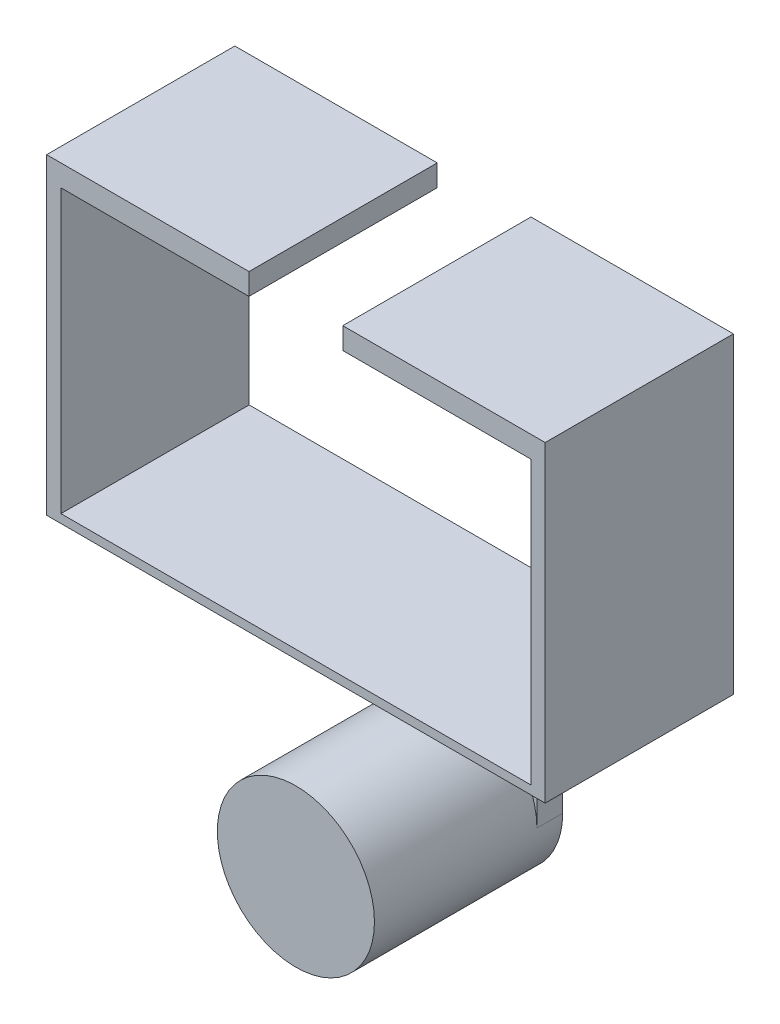
ISO-10303-21;
HEADER;
FILE_DESCRIPTION(('STEP AP214'),'2;1');
FILE_NAME('part.step','',(''),(''),'','','');
FILE_SCHEMA(('AUTOMOTIVE_DESIGN { 1 0 10303 214 1 1 1 1 }'));
ENDSEC;
DATA;
#1=APPLICATION_CONTEXT('core data for automotive mechanical design processes');
#2=APPLICATION_PROTOCOL_DEFINITION('international standard','automotive_design',2000,#1);
#3=PRODUCT_CONTEXT('',#1,'mechanical');
#4=PRODUCT('Part','Part','',(#3));
#5=PRODUCT_RELATED_PRODUCT_CATEGORY('part','',(#4));
#6=PRODUCT_DEFINITION_FORMATION('','',#4);
#7=PRODUCT_DEFINITION_CONTEXT('part definition',#1,'design');
#8=PRODUCT_DEFINITION('design','',#6,#7);
#9=PRODUCT_DEFINITION_SHAPE('','',#8);
#10=(LENGTH_UNIT() NAMED_UNIT(*) SI_UNIT(.MILLI.,.METRE.));
#11=(NAMED_UNIT(*) PLANE_ANGLE_UNIT() SI_UNIT($,.RADIAN.));
#12=(NAMED_UNIT(*) SI_UNIT($,.STERADIAN.) SOLID_ANGLE_UNIT());
#13=UNCERTAINTY_MEASURE_WITH_UNIT(LENGTH_MEASURE(1.E-05),#10,'distance_accuracy_value','');
#14=(GEOMETRIC_REPRESENTATION_CONTEXT(3) GLOBAL_UNCERTAINTY_ASSIGNED_CONTEXT((#13)) GLOBAL_UNIT_ASSIGNED_CONTEXT((#10,
#11,#12)) REPRESENTATION_CONTEXT('',''));
#15=CARTESIAN_POINT('',(0.,0.,0.));
#16=DIRECTION('',(0.,0.,1.));
#17=DIRECTION('',(1.,0.,0.));
#18=AXIS2_PLACEMENT_3D('',#15,#16,#17);
#19=CARTESIAN_POINT('',(0.,0.,25.4));
#20=DIRECTION('',(0.,0.,-1.));
#21=DIRECTION('',(-1.,0.,0.));
#22=AXIS2_PLACEMENT_3D('',#19,#20,#21);
#23=CYLINDRICAL_SURFACE('',#22,10.603707514376);
#24=CARTESIAN_POINT('',(0.,0.,3.47673544034519));
#25=DIRECTION('',(0.,0.,1.));
#26=DIRECTION('',(1.,0.,0.));
#27=AXIS2_PLACEMENT_3D('',#24,#25,#26);
#28=CIRCLE('',#27,10.603707514376);
#29=CARTESIAN_POINT('',(10.603707514376,0.,3.47673544034519));
#30=VERTEX_POINT('',#29);
#31=CARTESIAN_POINT('',(-10.603707514376,0.,3.47673544034519));
#32=VERTEX_POINT('',#31);
#33=EDGE_CURVE('E14',#30,#32,#28,.T.);
#34=ORIENTED_EDGE('',*,*,#33,.T.);
#35=DIRECTION('',(0.,0.,-1.));
#36=VECTOR('',#35,1.);
#37=CARTESIAN_POINT('',(-10.603707514376,0.,3.47673544034518));
#38=LINE('',#37,#36);
#39=CARTESIAN_POINT('',(-10.603707514376,0.,0.));
#40=VERTEX_POINT('',#39);
#41=EDGE_CURVE('E472',#32,#40,#38,.T.);
#42=ORIENTED_EDGE('',*,*,#41,.T.);
#43=CARTESIAN_POINT('',(0.,0.,0.));
#44=DIRECTION('',(0.,0.,1.));
#45=DIRECTION('',(1.,0.,0.));
#46=AXIS2_PLACEMENT_3D('',#43,#44,#45);
#47=CIRCLE('',#46,10.603707514376);
#48=CARTESIAN_POINT('',(10.603707514376,0.,0.));
#49=VERTEX_POINT('',#48);
#50=EDGE_CURVE('E479',#40,#49,#47,.T.);
#51=ORIENTED_EDGE('',*,*,#50,.T.);
#52=DIRECTION('',(0.,0.,-1.));
#53=VECTOR('',#52,1.);
#54=CARTESIAN_POINT('',(10.603707514376,0.,3.47673544034518));
#55=LINE('',#54,#53);
#56=EDGE_CURVE('E288',#30,#49,#55,.T.);
#57=ORIENTED_EDGE('',*,*,#56,.F.);
#58=EDGE_LOOP('',(#34,#42,#51,#57));
#59=FACE_BOUND('',#58,.T.);
#60=CARTESIAN_POINT('',(0.,0.,25.4));
#61=DIRECTION('',(0.,0.,1.));
#62=DIRECTION('',(1.,0.,0.));
#63=AXIS2_PLACEMENT_3D('',#60,#61,#62);
#64=CIRCLE('',#63,10.603707514376);
#65=CARTESIAN_POINT('',(10.603707514376,0.,25.4));
#66=VERTEX_POINT('',#65);
#67=EDGE_CURVE('E281',#66,#66,#64,.T.);
#68=ORIENTED_EDGE('',*,*,#67,.F.);
#69=EDGE_LOOP('',(#68));
#70=FACE_BOUND('',#69,.T.);
#71=ADVANCED_FACE('F274',(#59,#70),#23,.T.);
#72=CARTESIAN_POINT('',(0.,0.,25.4));
#73=DIRECTION('',(0.,0.,1.));
#74=DIRECTION('',(1.,0.,0.));
#75=AXIS2_PLACEMENT_3D('',#72,#73,#74);
#76=PLANE('',#75);
#77=ORIENTED_EDGE('',*,*,#67,.T.);
#78=EDGE_LOOP('',(#77));
#79=FACE_BOUND('',#78,.T.);
#80=ADVANCED_FACE('F516',(#79),#76,.T.);
#81=CARTESIAN_POINT('',(0.,0.,0.));
#82=DIRECTION('',(0.,0.,1.));
#83=DIRECTION('',(1.,0.,0.));
#84=AXIS2_PLACEMENT_3D('',#81,#82,#83);
#85=PLANE('',#84);
#86=ORIENTED_EDGE('',*,*,#50,.F.);
#87=DIRECTION('',(0.,1.,0.));
#88=VECTOR('',#87,1.);
#89=CARTESIAN_POINT('',(-10.603707514376,25.4,0.));
#90=LINE('',#89,#88);
#91=CARTESIAN_POINT('',(-10.603707514376,25.4,0.));
#92=VERTEX_POINT('',#91);
#93=EDGE_CURVE('E413',#40,#92,#90,.T.);
#94=ORIENTED_EDGE('',*,*,#93,.T.);
#95=DIRECTION('',(1.,0.,0.));
#96=VECTOR('',#95,1.);
#97=CARTESIAN_POINT('',(-33.6408091146479,25.4,0.));
#98=LINE('',#97,#96);
#99=CARTESIAN_POINT('',(-33.6408091146479,25.4,0.));
#100=VERTEX_POINT('',#99);
#101=EDGE_CURVE('E403',#100,#92,#98,.T.);
#102=ORIENTED_EDGE('',*,*,#101,.F.);
#103=DIRECTION('',(0.,-1.,0.));
#104=VECTOR('',#103,1.);
#105=CARTESIAN_POINT('',(-33.6408091146479,67.5425986019625,0.));
#106=LINE('',#105,#104);
#107=CARTESIAN_POINT('',(-33.6408091146479,67.5425986019625,0.));
#108=VERTEX_POINT('',#107);
#109=EDGE_CURVE('E387',#108,#100,#106,.T.);
#110=ORIENTED_EDGE('',*,*,#109,.F.);
#111=DIRECTION('',(-1.,0.,0.));
#112=VECTOR('',#111,1.);
#113=CARTESIAN_POINT('',(-6.3246,67.5425986019625,0.));
#114=LINE('',#113,#112);
#115=CARTESIAN_POINT('',(-6.3246,67.5425986019625,0.));
#116=VERTEX_POINT('',#115);
#117=EDGE_CURVE('E397',#116,#108,#114,.T.);
#118=ORIENTED_EDGE('',*,*,#117,.F.);
#119=DIRECTION('',(0.,1.,0.));
#120=VECTOR('',#119,1.);
#121=CARTESIAN_POINT('',(-6.3246,64.6374173140751,0.));
#122=LINE('',#121,#120);
#123=CARTESIAN_POINT('',(-6.3246,64.6374173140751,0.));
#124=VERTEX_POINT('',#123);
#125=EDGE_CURVE('E614',#124,#116,#122,.T.);
#126=ORIENTED_EDGE('',*,*,#125,.F.);
#127=DIRECTION('',(1.,0.,0.));
#128=VECTOR('',#127,1.);
#129=CARTESIAN_POINT('',(-31.70428,64.6374173140751,0.));
#130=LINE('',#129,#128);
#131=CARTESIAN_POINT('',(-31.70428,64.6374173140751,0.));
#132=VERTEX_POINT('',#131);
#133=EDGE_CURVE('E613',#132,#124,#130,.T.);
#134=ORIENTED_EDGE('',*,*,#133,.F.);
#135=DIRECTION('',(0.,1.,0.));
#136=VECTOR('',#135,1.);
#137=CARTESIAN_POINT('',(-31.70428,26.5628173140751,0.));
#138=LINE('',#137,#136);
#139=CARTESIAN_POINT('',(-31.70428,26.5628173140751,0.));
#140=VERTEX_POINT('',#139);
#141=EDGE_CURVE('E609',#140,#132,#138,.T.);
#142=ORIENTED_EDGE('',*,*,#141,.F.);
#143=DIRECTION('',(-1.,0.,0.));
#144=VECTOR('',#143,1.);
#145=CARTESIAN_POINT('',(31.70428,26.5628173140751,0.));
#146=LINE('',#145,#144);
#147=CARTESIAN_POINT('',(31.70428,26.5628173140751,0.));
#148=VERTEX_POINT('',#147);
#149=EDGE_CURVE('E604',#148,#140,#146,.T.);
#150=ORIENTED_EDGE('',*,*,#149,.F.);
#151=DIRECTION('',(0.,-1.,0.));
#152=VECTOR('',#151,1.);
#153=CARTESIAN_POINT('',(31.70428,64.6374173140751,0.));
#154=LINE('',#153,#152);
#155=CARTESIAN_POINT('',(31.70428,64.6374173140751,0.));
#156=VERTEX_POINT('',#155);
#157=EDGE_CURVE('E605',#156,#148,#154,.T.);
#158=ORIENTED_EDGE('',*,*,#157,.F.);
#159=DIRECTION('',(1.,0.,0.));
#160=VECTOR('',#159,1.);
#161=CARTESIAN_POINT('',(6.3246,64.6374173140751,0.));
#162=LINE('',#161,#160);
#163=CARTESIAN_POINT('',(6.3246,64.6374173140751,0.));
#164=VERTEX_POINT('',#163);
#165=EDGE_CURVE('E600',#164,#156,#162,.T.);
#166=ORIENTED_EDGE('',*,*,#165,.F.);
#167=DIRECTION('',(0.,-1.,0.));
#168=VECTOR('',#167,1.);
#169=CARTESIAN_POINT('',(6.3246,67.5425986019625,0.));
#170=LINE('',#169,#168);
#171=CARTESIAN_POINT('',(6.3246,67.5425986019625,0.));
#172=VERTEX_POINT('',#171);
#173=EDGE_CURVE('E593',#172,#164,#170,.T.);
#174=ORIENTED_EDGE('',*,*,#173,.F.);
#175=DIRECTION('',(-1.,0.,0.));
#176=VECTOR('',#175,1.);
#177=CARTESIAN_POINT('',(33.6408091146479,67.5425986019625,0.));
#178=LINE('',#177,#176);
#179=CARTESIAN_POINT('',(33.6408091146479,67.5425986019625,0.));
#180=VERTEX_POINT('',#179);
#181=EDGE_CURVE('E584',#180,#172,#178,.T.);
#182=ORIENTED_EDGE('',*,*,#181,.F.);
#183=DIRECTION('',(0.,1.,0.));
#184=VECTOR('',#183,1.);
#185=CARTESIAN_POINT('',(33.6408091146479,25.4,0.));
#186=LINE('',#185,#184);
#187=CARTESIAN_POINT('',(33.6408091146479,25.4,0.));
#188=VERTEX_POINT('',#187);
#189=EDGE_CURVE('E421',#188,#180,#186,.T.);
#190=ORIENTED_EDGE('',*,*,#189,.F.);
#191=CARTESIAN_POINT('',(10.603707514376,25.4,0.));
#192=VERTEX_POINT('',#191);
#193=EDGE_CURVE('E418',#192,#188,#98,.T.);
#194=ORIENTED_EDGE('',*,*,#193,.F.);
#195=DIRECTION('',(0.,-1.,0.));
#196=VECTOR('',#195,1.);
#197=CARTESIAN_POINT('',(10.603707514376,0.,0.));
#198=LINE('',#197,#196);
#199=EDGE_CURVE('E423',#192,#49,#198,.T.);
#200=ORIENTED_EDGE('',*,*,#199,.T.);
#201=EDGE_LOOP('',(#86,#94,#102,#110,#118,#126,#134,#142,#150,#158,#166,#174,#182,#190,#194,#200));
#202=FACE_BOUND('',#201,.T.);
#203=ADVANCED_FACE('F415',(#202),#85,.F.);
#204=CARTESIAN_POINT('',(0.,0.,3.47673544034518));
#205=DIRECTION('',(0.,0.,1.));
#206=DIRECTION('',(1.,0.,0.));
#207=AXIS2_PLACEMENT_3D('',#204,#205,#206);
#208=PLANE('',#207);
#209=ORIENTED_EDGE('',*,*,#33,.F.);
#210=DIRECTION('',(0.,-1.,0.));
#211=VECTOR('',#210,1.);
#212=CARTESIAN_POINT('',(10.603707514376,0.,3.47673544034518));
#213=LINE('',#212,#211);
#214=CARTESIAN_POINT('',(10.603707514376,25.4,3.47673544034518));
#215=VERTEX_POINT('',#214);
#216=EDGE_CURVE('E468',#215,#30,#213,.T.);
#217=ORIENTED_EDGE('',*,*,#216,.F.);
#218=DIRECTION('',(1.,0.,0.));
#219=VECTOR('',#218,1.);
#220=CARTESIAN_POINT('',(10.603707514376,25.4,3.47673544034518));
#221=LINE('',#220,#219);
#222=CARTESIAN_POINT('',(-10.603707514376,25.4,3.47673544034518));
#223=VERTEX_POINT('',#222);
#224=EDGE_CURVE('E462',#223,#215,#221,.T.);
#225=ORIENTED_EDGE('',*,*,#224,.F.);
#226=DIRECTION('',(0.,1.,0.));
#227=VECTOR('',#226,1.);
#228=CARTESIAN_POINT('',(-10.603707514376,25.4,3.47673544034518));
#229=LINE('',#228,#227);
#230=EDGE_CURVE('E463',#32,#223,#229,.T.);
#231=ORIENTED_EDGE('',*,*,#230,.F.);
#232=EDGE_LOOP('',(#209,#217,#225,#231));
#233=FACE_BOUND('',#232,.T.);
#234=ADVANCED_FACE('F501',(#233),#208,.T.);
#235=CARTESIAN_POINT('',(10.603707514376,0.,3.47673544034518));
#236=DIRECTION('',(1.,0.,0.));
#237=DIRECTION('',(0.,0.,-1.));
#238=AXIS2_PLACEMENT_3D('',#235,#236,#237);
#239=PLANE('',#238);
#240=ORIENTED_EDGE('',*,*,#199,.F.);
#241=DIRECTION('',(0.,0.,-1.));
#242=VECTOR('',#241,1.);
#243=CARTESIAN_POINT('',(10.603707514376,25.4,3.47673544034518));
#244=LINE('',#243,#242);
#245=EDGE_CURVE('E477',#215,#192,#244,.T.);
#246=ORIENTED_EDGE('',*,*,#245,.F.);
#247=ORIENTED_EDGE('',*,*,#216,.T.);
#248=ORIENTED_EDGE('',*,*,#56,.T.);
#249=EDGE_LOOP('',(#240,#246,#247,#248));
#250=FACE_BOUND('',#249,.T.);
#251=ADVANCED_FACE('F494',(#250),#239,.T.);
#252=CARTESIAN_POINT('',(-10.603707514376,25.4,3.47673544034518));
#253=DIRECTION('',(-1.,0.,0.));
#254=DIRECTION('',(0.,0.,1.));
#255=AXIS2_PLACEMENT_3D('',#252,#253,#254);
#256=PLANE('',#255);
#257=ORIENTED_EDGE('',*,*,#93,.F.);
#258=ORIENTED_EDGE('',*,*,#41,.F.);
#259=ORIENTED_EDGE('',*,*,#230,.T.);
#260=DIRECTION('',(0.,0.,-1.));
#261=VECTOR('',#260,1.);
#262=CARTESIAN_POINT('',(-10.603707514376,25.4,3.47673544034518));
#263=LINE('',#262,#261);
#264=EDGE_CURVE('E482',#223,#92,#263,.T.);
#265=ORIENTED_EDGE('',*,*,#264,.T.);
#266=EDGE_LOOP('',(#257,#258,#259,#265));
#267=FACE_BOUND('',#266,.T.);
#268=ADVANCED_FACE('F506',(#267),#256,.T.);
#269=CARTESIAN_POINT('',(-33.6408091146479,25.4,25.4));
#270=DIRECTION('',(0.,1.,0.));
#271=DIRECTION('',(0.,0.,1.));
#272=AXIS2_PLACEMENT_3D('',#269,#270,#271);
#273=PLANE('',#272);
#274=ORIENTED_EDGE('',*,*,#264,.F.);
#275=ORIENTED_EDGE('',*,*,#224,.T.);
#276=ORIENTED_EDGE('',*,*,#245,.T.);
#277=ORIENTED_EDGE('',*,*,#193,.T.);
#278=DIRECTION('',(0.,0.,-1.));
#279=VECTOR('',#278,1.);
#280=CARTESIAN_POINT('',(33.6408091146479,25.4,25.4));
#281=LINE('',#280,#279);
#282=CARTESIAN_POINT('',(33.6408091146479,25.4,25.4));
#283=VERTEX_POINT('',#282);
#284=EDGE_CURVE('E503',#283,#188,#281,.T.);
#285=ORIENTED_EDGE('',*,*,#284,.F.);
#286=DIRECTION('',(1.,0.,0.));
#287=VECTOR('',#286,1.);
#288=CARTESIAN_POINT('',(-33.6408091146479,25.4,25.4));
#289=LINE('',#288,#287);
#290=CARTESIAN_POINT('',(-33.6408091146479,25.4,25.4));
#291=VERTEX_POINT('',#290);
#292=EDGE_CURVE('E398',#291,#283,#289,.T.);
#293=ORIENTED_EDGE('',*,*,#292,.F.);
#294=DIRECTION('',(0.,0.,-1.));
#295=VECTOR('',#294,1.);
#296=CARTESIAN_POINT('',(-33.6408091146479,25.4,25.4));
#297=LINE('',#296,#295);
#298=EDGE_CURVE('E388',#291,#100,#297,.T.);
#299=ORIENTED_EDGE('',*,*,#298,.T.);
#300=ORIENTED_EDGE('',*,*,#101,.T.);
#301=EDGE_LOOP('',(#274,#275,#276,#277,#285,#293,#299,#300));
#302=FACE_BOUND('',#301,.T.);
#303=ADVANCED_FACE('F404',(#302),#273,.F.);
#304=CARTESIAN_POINT('',(33.6408091146479,25.4,25.4));
#305=DIRECTION('',(-1.,0.,0.));
#306=DIRECTION('',(0.,-1.,0.));
#307=AXIS2_PLACEMENT_3D('',#304,#305,#306);
#308=PLANE('',#307);
#309=ORIENTED_EDGE('',*,*,#189,.T.);
#310=DIRECTION('',(0.,0.,-1.));
#311=VECTOR('',#310,1.);
#312=CARTESIAN_POINT('',(33.6408091146479,67.5425986019625,25.4));
#313=LINE('',#312,#311);
#314=CARTESIAN_POINT('',(33.6408091146479,67.5425986019625,25.4));
#315=VERTEX_POINT('',#314);
#316=EDGE_CURVE('E582',#315,#180,#313,.T.);
#317=ORIENTED_EDGE('',*,*,#316,.F.);
#318=DIRECTION('',(0.,1.,0.));
#319=VECTOR('',#318,1.);
#320=CARTESIAN_POINT('',(33.6408091146479,25.4,25.4));
#321=LINE('',#320,#319);
#322=EDGE_CURVE('E457',#283,#315,#321,.T.);
#323=ORIENTED_EDGE('',*,*,#322,.F.);
#324=ORIENTED_EDGE('',*,*,#284,.T.);
#325=EDGE_LOOP('',(#309,#317,#323,#324));
#326=FACE_BOUND('',#325,.T.);
#327=ADVANCED_FACE('F511',(#326),#308,.F.);
#328=CARTESIAN_POINT('',(33.6408091146479,67.5425986019625,25.4));
#329=DIRECTION('',(0.,-1.,0.));
#330=DIRECTION('',(0.,0.,-1.));
#331=AXIS2_PLACEMENT_3D('',#328,#329,#330);
#332=PLANE('',#331);
#333=ORIENTED_EDGE('',*,*,#181,.T.);
#334=DIRECTION('',(0.,0.,-1.));
#335=VECTOR('',#334,1.);
#336=CARTESIAN_POINT('',(6.3246,67.5425986019625,25.4));
#337=LINE('',#336,#335);
#338=CARTESIAN_POINT('',(6.3246,67.5425986019625,25.4));
#339=VERTEX_POINT('',#338);
#340=EDGE_CURVE('E589',#339,#172,#337,.T.);
#341=ORIENTED_EDGE('',*,*,#340,.F.);
#342=DIRECTION('',(-1.,0.,0.));
#343=VECTOR('',#342,1.);
#344=CARTESIAN_POINT('',(33.6408091146479,67.5425986019625,25.4));
#345=LINE('',#344,#343);
#346=EDGE_CURVE('E452',#315,#339,#345,.T.);
#347=ORIENTED_EDGE('',*,*,#346,.F.);
#348=ORIENTED_EDGE('',*,*,#316,.T.);
#349=EDGE_LOOP('',(#333,#341,#347,#348));
#350=FACE_BOUND('',#349,.T.);
#351=ADVANCED_FACE('F573',(#350),#332,.F.);
#352=CARTESIAN_POINT('',(6.3246,67.5425986019625,25.4));
#353=DIRECTION('',(1.,0.,0.));
#354=DIRECTION('',(0.,0.,-1.));
#355=AXIS2_PLACEMENT_3D('',#352,#353,#354);
#356=PLANE('',#355);
#357=ORIENTED_EDGE('',*,*,#173,.T.);
#358=DIRECTION('',(0.,0.,-1.));
#359=VECTOR('',#358,1.);
#360=CARTESIAN_POINT('',(6.3246,64.6374173140751,25.4));
#361=LINE('',#360,#359);
#362=CARTESIAN_POINT('',(6.3246,64.6374173140751,25.4));
#363=VERTEX_POINT('',#362);
#364=EDGE_CURVE('E642',#363,#164,#361,.T.);
#365=ORIENTED_EDGE('',*,*,#364,.F.);
#366=DIRECTION('',(0.,-1.,0.));
#367=VECTOR('',#366,1.);
#368=CARTESIAN_POINT('',(6.3246,67.5425986019625,25.4));
#369=LINE('',#368,#367);
#370=EDGE_CURVE('E447',#339,#363,#369,.T.);
#371=ORIENTED_EDGE('',*,*,#370,.F.);
#372=ORIENTED_EDGE('',*,*,#340,.T.);
#373=EDGE_LOOP('',(#357,#365,#371,#372));
#374=FACE_BOUND('',#373,.T.);
#375=ADVANCED_FACE('F570',(#374),#356,.F.);
#376=CARTESIAN_POINT('',(6.3246,64.6374173140751,25.4));
#377=DIRECTION('',(0.,1.,0.));
#378=DIRECTION('',(-1.,0.,0.));
#379=AXIS2_PLACEMENT_3D('',#376,#377,#378);
#380=PLANE('',#379);
#381=ORIENTED_EDGE('',*,*,#165,.T.);
#382=DIRECTION('',(0.,0.,-1.));
#383=VECTOR('',#382,1.);
#384=CARTESIAN_POINT('',(31.70428,64.6374173140751,25.4));
#385=LINE('',#384,#383);
#386=CARTESIAN_POINT('',(31.70428,64.6374173140751,25.4));
#387=VERTEX_POINT('',#386);
#388=EDGE_CURVE('E643',#387,#156,#385,.T.);
#389=ORIENTED_EDGE('',*,*,#388,.F.);
#390=DIRECTION('',(1.,0.,0.));
#391=VECTOR('',#390,1.);
#392=CARTESIAN_POINT('',(6.3246,64.6374173140751,25.4));
#393=LINE('',#392,#391);
#394=EDGE_CURVE('E450',#363,#387,#393,.T.);
#395=ORIENTED_EDGE('',*,*,#394,.F.);
#396=ORIENTED_EDGE('',*,*,#364,.T.);
#397=EDGE_LOOP('',(#381,#389,#395,#396));
#398=FACE_BOUND('',#397,.T.);
#399=ADVANCED_FACE('F562',(#398),#380,.F.);
#400=CARTESIAN_POINT('',(31.70428,64.6374173140751,25.4));
#401=DIRECTION('',(1.,0.,0.));
#402=DIRECTION('',(0.,1.,0.));
#403=AXIS2_PLACEMENT_3D('',#400,#401,#402);
#404=PLANE('',#403);
#405=ORIENTED_EDGE('',*,*,#157,.T.);
#406=DIRECTION('',(0.,0.,-1.));
#407=VECTOR('',#406,1.);
#408=CARTESIAN_POINT('',(31.70428,26.5628173140751,25.4));
#409=LINE('',#408,#407);
#410=CARTESIAN_POINT('',(31.70428,26.5628173140751,25.4));
#411=VERTEX_POINT('',#410);
#412=EDGE_CURVE('E637',#411,#148,#409,.T.);
#413=ORIENTED_EDGE('',*,*,#412,.F.);
#414=DIRECTION('',(0.,-1.,0.));
#415=VECTOR('',#414,1.);
#416=CARTESIAN_POINT('',(31.70428,64.6374173140751,25.4));
#417=LINE('',#416,#415);
#418=EDGE_CURVE('E441',#387,#411,#417,.T.);
#419=ORIENTED_EDGE('',*,*,#418,.F.);
#420=ORIENTED_EDGE('',*,*,#388,.T.);
#421=EDGE_LOOP('',(#405,#413,#419,#420));
#422=FACE_BOUND('',#421,.T.);
#423=ADVANCED_FACE('F559',(#422),#404,.F.);
#424=CARTESIAN_POINT('',(31.70428,26.5628173140751,25.4));
#425=DIRECTION('',(0.,-1.,0.));
#426=DIRECTION('',(0.,0.,-1.));
#427=AXIS2_PLACEMENT_3D('',#424,#425,#426);
#428=PLANE('',#427);
#429=ORIENTED_EDGE('',*,*,#149,.T.);
#430=DIRECTION('',(0.,0.,-1.));
#431=VECTOR('',#430,1.);
#432=CARTESIAN_POINT('',(-31.70428,26.5628173140751,25.4));
#433=LINE('',#432,#431);
#434=CARTESIAN_POINT('',(-31.70428,26.5628173140751,25.4));
#435=VERTEX_POINT('',#434);
#436=EDGE_CURVE('E632',#435,#140,#433,.T.);
#437=ORIENTED_EDGE('',*,*,#436,.F.);
#438=DIRECTION('',(-1.,0.,0.));
#439=VECTOR('',#438,1.);
#440=CARTESIAN_POINT('',(31.70428,26.5628173140751,25.4));
#441=LINE('',#440,#439);
#442=EDGE_CURVE('E442',#411,#435,#441,.T.);
#443=ORIENTED_EDGE('',*,*,#442,.F.);
#444=ORIENTED_EDGE('',*,*,#412,.T.);
#445=EDGE_LOOP('',(#429,#437,#443,#444));
#446=FACE_BOUND('',#445,.T.);
#447=ADVANCED_FACE('F553',(#446),#428,.F.);
#448=CARTESIAN_POINT('',(-31.70428,26.5628173140751,25.4));
#449=DIRECTION('',(-1.,0.,0.));
#450=DIRECTION('',(0.,-1.,0.));
#451=AXIS2_PLACEMENT_3D('',#448,#449,#450);
#452=PLANE('',#451);
#453=ORIENTED_EDGE('',*,*,#141,.T.);
#454=DIRECTION('',(0.,0.,-1.));
#455=VECTOR('',#454,1.);
#456=CARTESIAN_POINT('',(-31.70428,64.6374173140751,25.4));
#457=LINE('',#456,#455);
#458=CARTESIAN_POINT('',(-31.70428,64.6374173140751,25.4));
#459=VERTEX_POINT('',#458);
#460=EDGE_CURVE('E629',#459,#132,#457,.T.);
#461=ORIENTED_EDGE('',*,*,#460,.F.);
#462=DIRECTION('',(0.,1.,0.));
#463=VECTOR('',#462,1.);
#464=CARTESIAN_POINT('',(-31.70428,26.5628173140751,25.4));
#465=LINE('',#464,#463);
#466=EDGE_CURVE('E437',#435,#459,#465,.T.);
#467=ORIENTED_EDGE('',*,*,#466,.F.);
#468=ORIENTED_EDGE('',*,*,#436,.T.);
#469=EDGE_LOOP('',(#453,#461,#467,#468));
#470=FACE_BOUND('',#469,.T.);
#471=ADVANCED_FACE('F552',(#470),#452,.F.);
#472=CARTESIAN_POINT('',(-31.70428,64.6374173140751,25.4));
#473=DIRECTION('',(0.,1.,0.));
#474=DIRECTION('',(-1.,0.,0.));
#475=AXIS2_PLACEMENT_3D('',#472,#473,#474);
#476=PLANE('',#475);
#477=ORIENTED_EDGE('',*,*,#133,.T.);
#478=DIRECTION('',(0.,0.,-1.));
#479=VECTOR('',#478,1.);
#480=CARTESIAN_POINT('',(-6.3246,64.6374173140751,25.4));
#481=LINE('',#480,#479);
#482=CARTESIAN_POINT('',(-6.3246,64.6374173140751,25.4));
#483=VERTEX_POINT('',#482);
#484=EDGE_CURVE('E623',#483,#124,#481,.T.);
#485=ORIENTED_EDGE('',*,*,#484,.F.);
#486=DIRECTION('',(1.,0.,0.));
#487=VECTOR('',#486,1.);
#488=CARTESIAN_POINT('',(-31.70428,64.6374173140751,25.4));
#489=LINE('',#488,#487);
#490=EDGE_CURVE('E434',#459,#483,#489,.T.);
#491=ORIENTED_EDGE('',*,*,#490,.F.);
#492=ORIENTED_EDGE('',*,*,#460,.T.);
#493=EDGE_LOOP('',(#477,#485,#491,#492));
#494=FACE_BOUND('',#493,.T.);
#495=ADVANCED_FACE('F550',(#494),#476,.F.);
#496=CARTESIAN_POINT('',(-6.3246,64.6374173140751,25.4));
#497=DIRECTION('',(-1.,0.,0.));
#498=DIRECTION('',(0.,0.,1.));
#499=AXIS2_PLACEMENT_3D('',#496,#497,#498);
#500=PLANE('',#499);
#501=ORIENTED_EDGE('',*,*,#125,.T.);
#502=DIRECTION('',(0.,0.,-1.));
#503=VECTOR('',#502,1.);
#504=CARTESIAN_POINT('',(-6.3246,67.5425986019625,25.4));
#505=LINE('',#504,#503);
#506=CARTESIAN_POINT('',(-6.3246,67.5425986019625,25.4));
#507=VERTEX_POINT('',#506);
#508=EDGE_CURVE('E622',#507,#116,#505,.T.);
#509=ORIENTED_EDGE('',*,*,#508,.F.);
#510=DIRECTION('',(0.,1.,0.));
#511=VECTOR('',#510,1.);
#512=CARTESIAN_POINT('',(-6.3246,64.6374173140751,25.4));
#513=LINE('',#512,#511);
#514=EDGE_CURVE('E435',#483,#507,#513,.T.);
#515=ORIENTED_EDGE('',*,*,#514,.F.);
#516=ORIENTED_EDGE('',*,*,#484,.T.);
#517=EDGE_LOOP('',(#501,#509,#515,#516));
#518=FACE_BOUND('',#517,.T.);
#519=ADVANCED_FACE('F543',(#518),#500,.F.);
#520=CARTESIAN_POINT('',(-6.3246,67.5425986019625,25.4));
#521=DIRECTION('',(0.,-1.,0.));
#522=DIRECTION('',(0.,0.,-1.));
#523=AXIS2_PLACEMENT_3D('',#520,#521,#522);
#524=PLANE('',#523);
#525=ORIENTED_EDGE('',*,*,#117,.T.);
#526=DIRECTION('',(0.,0.,-1.));
#527=VECTOR('',#526,1.);
#528=CARTESIAN_POINT('',(-33.6408091146479,67.5425986019625,25.4));
#529=LINE('',#528,#527);
#530=CARTESIAN_POINT('',(-33.6408091146479,67.5425986019625,25.4));
#531=VERTEX_POINT('',#530);
#532=EDGE_CURVE('E391',#531,#108,#529,.T.);
#533=ORIENTED_EDGE('',*,*,#532,.F.);
#534=DIRECTION('',(-1.,0.,0.));
#535=VECTOR('',#534,1.);
#536=CARTESIAN_POINT('',(-6.3246,67.5425986019625,25.4));
#537=LINE('',#536,#535);
#538=EDGE_CURVE('E427',#507,#531,#537,.T.);
#539=ORIENTED_EDGE('',*,*,#538,.F.);
#540=ORIENTED_EDGE('',*,*,#508,.T.);
#541=EDGE_LOOP('',(#525,#533,#539,#540));
#542=FACE_BOUND('',#541,.T.);
#543=ADVANCED_FACE('F539',(#542),#524,.F.);
#544=CARTESIAN_POINT('',(-33.6408091146479,67.5425986019625,25.4));
#545=DIRECTION('',(1.,0.,0.));
#546=DIRECTION('',(0.,1.,0.));
#547=AXIS2_PLACEMENT_3D('',#544,#545,#546);
#548=PLANE('',#547);
#549=ORIENTED_EDGE('',*,*,#109,.T.);
#550=ORIENTED_EDGE('',*,*,#298,.F.);
#551=DIRECTION('',(0.,-1.,0.));
#552=VECTOR('',#551,1.);
#553=CARTESIAN_POINT('',(-33.6408091146479,67.5425986019625,25.4));
#554=LINE('',#553,#552);
#555=EDGE_CURVE('E409',#531,#291,#554,.T.);
#556=ORIENTED_EDGE('',*,*,#555,.F.);
#557=ORIENTED_EDGE('',*,*,#532,.T.);
#558=EDGE_LOOP('',(#549,#550,#556,#557));
#559=FACE_BOUND('',#558,.T.);
#560=ADVANCED_FACE('F389',(#559),#548,.F.);
#561=CARTESIAN_POINT('',(0.,0.,25.4));
#562=DIRECTION('',(0.,0.,1.));
#563=DIRECTION('',(1.,0.,0.));
#564=AXIS2_PLACEMENT_3D('',#561,#562,#563);
#565=PLANE('',#564);
#566=ORIENTED_EDGE('',*,*,#292,.T.);
#567=ORIENTED_EDGE('',*,*,#322,.T.);
#568=ORIENTED_EDGE('',*,*,#346,.T.);
#569=ORIENTED_EDGE('',*,*,#370,.T.);
#570=ORIENTED_EDGE('',*,*,#394,.T.);
#571=ORIENTED_EDGE('',*,*,#418,.T.);
#572=ORIENTED_EDGE('',*,*,#442,.T.);
#573=ORIENTED_EDGE('',*,*,#466,.T.);
#574=ORIENTED_EDGE('',*,*,#490,.T.);
#575=ORIENTED_EDGE('',*,*,#514,.T.);
#576=ORIENTED_EDGE('',*,*,#538,.T.);
#577=ORIENTED_EDGE('',*,*,#555,.T.);
#578=EDGE_LOOP('',(#566,#567,#568,#569,#570,#571,#572,#573,#574,#575,#576,#577));
#579=FACE_BOUND('',#578,.T.);
#580=ADVANCED_FACE('F534',(#579),#565,.T.);
#581=CLOSED_SHELL('',(#71,#80,#203,#234,#251,#268,#303,#327,#351,#375,#399,#423,#447,#471,#495,
#519,#543,#560,#580));
#582=MANIFOLD_SOLID_BREP('B2',#581);
#583=ADVANCED_BREP_SHAPE_REPRESENTATION('',(#18,#582),#14);
#584=SHAPE_DEFINITION_REPRESENTATION(#9,#583);
ENDSEC;
END-ISO-10303-21;
